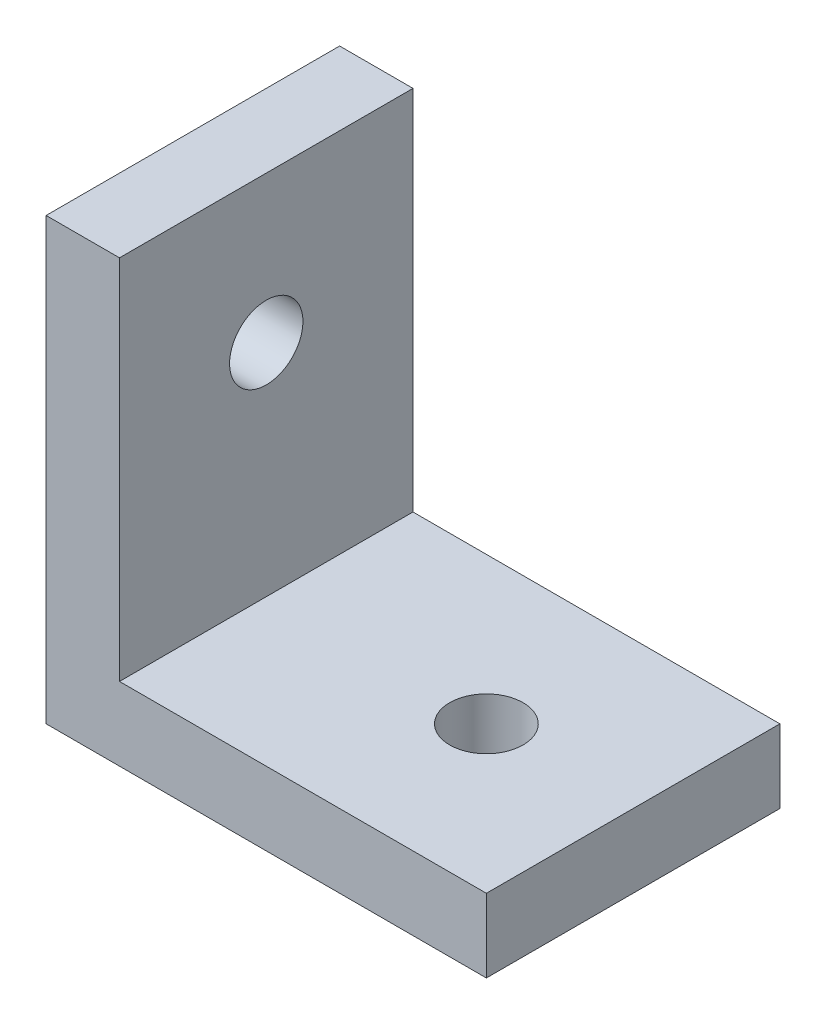
ISO-10303-21;
HEADER;
FILE_DESCRIPTION(('STEP AP214'),'2;1');
FILE_NAME('part.step','',(''),(''),'','','');
FILE_SCHEMA(('AUTOMOTIVE_DESIGN { 1 0 10303 214 1 1 1 1 }'));
ENDSEC;
DATA;
#1=APPLICATION_CONTEXT('core data for automotive mechanical design processes');
#2=APPLICATION_PROTOCOL_DEFINITION('international standard','automotive_design',2000,#1);
#3=PRODUCT_CONTEXT('',#1,'mechanical');
#4=PRODUCT('Part','Part','',(#3));
#5=PRODUCT_RELATED_PRODUCT_CATEGORY('part','',(#4));
#6=PRODUCT_DEFINITION_FORMATION('','',#4);
#7=PRODUCT_DEFINITION_CONTEXT('part definition',#1,'design');
#8=PRODUCT_DEFINITION('design','',#6,#7);
#9=PRODUCT_DEFINITION_SHAPE('','',#8);
#10=(LENGTH_UNIT() NAMED_UNIT(*) SI_UNIT(.MILLI.,.METRE.));
#11=(NAMED_UNIT(*) PLANE_ANGLE_UNIT() SI_UNIT($,.RADIAN.));
#12=(NAMED_UNIT(*) SI_UNIT($,.STERADIAN.) SOLID_ANGLE_UNIT());
#13=UNCERTAINTY_MEASURE_WITH_UNIT(LENGTH_MEASURE(1.E-05),#10,'distance_accuracy_value','');
#14=(GEOMETRIC_REPRESENTATION_CONTEXT(3) GLOBAL_UNCERTAINTY_ASSIGNED_CONTEXT((#13)) GLOBAL_UNIT_ASSIGNED_CONTEXT((#10,
#11,#12)) REPRESENTATION_CONTEXT('',''));
#15=CARTESIAN_POINT('',(0.,0.,0.));
#16=DIRECTION('',(0.,0.,1.));
#17=DIRECTION('',(1.,0.,0.));
#18=AXIS2_PLACEMENT_3D('',#15,#16,#17);
#19=CARTESIAN_POINT('',(-6.35,0.,25.4));
#20=DIRECTION('',(0.,-1.,0.));
#21=DIRECTION('',(0.,0.,-1.));
#22=AXIS2_PLACEMENT_3D('',#19,#20,#21);
#23=PLANE('',#22);
#24=DIRECTION('',(-1.,0.,0.));
#25=VECTOR('',#24,1.);
#26=CARTESIAN_POINT('',(-6.35,0.,0.));
#27=LINE('',#26,#25);
#28=CARTESIAN_POINT('',(0.,0.,0.));
#29=VERTEX_POINT('',#28);
#30=CARTESIAN_POINT('',(-6.35,0.,0.));
#31=VERTEX_POINT('',#30);
#32=EDGE_CURVE('E119',#29,#31,#27,.T.);
#33=ORIENTED_EDGE('',*,*,#32,.T.);
#34=DIRECTION('',(0.,0.,-1.));
#35=VECTOR('',#34,1.);
#36=CARTESIAN_POINT('',(-6.35,0.,25.4));
#37=LINE('',#36,#35);
#38=CARTESIAN_POINT('',(-6.35,0.,25.4));
#39=VERTEX_POINT('',#38);
#40=EDGE_CURVE('E11',#39,#31,#37,.T.);
#41=ORIENTED_EDGE('',*,*,#40,.F.);
#42=DIRECTION('',(-1.,0.,0.));
#43=VECTOR('',#42,1.);
#44=CARTESIAN_POINT('',(-6.35,0.,25.4));
#45=LINE('',#44,#43);
#46=CARTESIAN_POINT('',(0.,0.,25.4));
#47=VERTEX_POINT('',#46);
#48=EDGE_CURVE('E130',#47,#39,#45,.T.);
#49=ORIENTED_EDGE('',*,*,#48,.F.);
#50=DIRECTION('',(0.,0.,-1.));
#51=VECTOR('',#50,1.);
#52=CARTESIAN_POINT('',(0.,0.,25.4));
#53=LINE('',#52,#51);
#54=EDGE_CURVE('E115',#47,#29,#53,.T.);
#55=ORIENTED_EDGE('',*,*,#54,.T.);
#56=EDGE_LOOP('',(#33,#41,#49,#55));
#57=FACE_BOUND('',#56,.T.);
#58=ADVANCED_FACE('F35',(#57),#23,.F.);
#59=CARTESIAN_POINT('',(-6.35,0.,25.4));
#60=DIRECTION('',(1.,0.,0.));
#61=DIRECTION('',(0.,1.,0.));
#62=AXIS2_PLACEMENT_3D('',#59,#60,#61);
#63=PLANE('',#62);
#64=CARTESIAN_POINT('',(-6.35,-12.7,12.7));
#65=DIRECTION('',(1.,0.,0.));
#66=DIRECTION('',(0.,1.,0.));
#67=AXIS2_PLACEMENT_3D('',#64,#65,#66);
#68=CIRCLE('',#67,3.175);
#69=CARTESIAN_POINT('',(-6.35,-9.525,12.7));
#70=VERTEX_POINT('',#69);
#71=EDGE_CURVE('E123',#70,#70,#68,.F.);
#72=ORIENTED_EDGE('',*,*,#71,.F.);
#73=EDGE_LOOP('',(#72));
#74=FACE_BOUND('',#73,.T.);
#75=DIRECTION('',(0.,-1.,0.));
#76=VECTOR('',#75,1.);
#77=CARTESIAN_POINT('',(-6.35,0.,0.));
#78=LINE('',#77,#76);
#79=CARTESIAN_POINT('',(-6.35,-38.1,0.));
#80=VERTEX_POINT('',#79);
#81=EDGE_CURVE('E122',#31,#80,#78,.T.);
#82=ORIENTED_EDGE('',*,*,#81,.T.);
#83=DIRECTION('',(0.,0.,-1.));
#84=VECTOR('',#83,1.);
#85=CARTESIAN_POINT('',(-6.35,-38.1,25.4));
#86=LINE('',#85,#84);
#87=CARTESIAN_POINT('',(-6.35,-38.1,25.4));
#88=VERTEX_POINT('',#87);
#89=EDGE_CURVE('E43',#88,#80,#86,.T.);
#90=ORIENTED_EDGE('',*,*,#89,.F.);
#91=DIRECTION('',(0.,-1.,0.));
#92=VECTOR('',#91,1.);
#93=CARTESIAN_POINT('',(-6.35,0.,25.4));
#94=LINE('',#93,#92);
#95=EDGE_CURVE('E88',#39,#88,#94,.T.);
#96=ORIENTED_EDGE('',*,*,#95,.F.);
#97=ORIENTED_EDGE('',*,*,#40,.T.);
#98=EDGE_LOOP('',(#82,#90,#96,#97));
#99=FACE_BOUND('',#98,.T.);
#100=ADVANCED_FACE('F157',(#74,#99),#63,.F.);
#101=CARTESIAN_POINT('',(-6.35,-38.1,25.4));
#102=DIRECTION('',(0.,1.,0.));
#103=DIRECTION('',(0.,0.,1.));
#104=AXIS2_PLACEMENT_3D('',#101,#102,#103);
#105=PLANE('',#104);
#106=CARTESIAN_POINT('',(19.05,-38.1,12.7));
#107=DIRECTION('',(0.,1.,0.));
#108=DIRECTION('',(0.,0.,1.));
#109=AXIS2_PLACEMENT_3D('',#106,#107,#108);
#110=CIRCLE('',#109,3.175);
#111=CARTESIAN_POINT('',(19.05,-38.1,15.875));
#112=VERTEX_POINT('',#111);
#113=EDGE_CURVE('E238',#112,#112,#110,.F.);
#114=ORIENTED_EDGE('',*,*,#113,.F.);
#115=EDGE_LOOP('',(#114));
#116=FACE_BOUND('',#115,.T.);
#117=DIRECTION('',(1.,0.,0.));
#118=VECTOR('',#117,1.);
#119=CARTESIAN_POINT('',(-6.35,-38.1,0.));
#120=LINE('',#119,#118);
#121=CARTESIAN_POINT('',(31.75,-38.1,0.));
#122=VERTEX_POINT('',#121);
#123=EDGE_CURVE('E125',#80,#122,#120,.T.);
#124=ORIENTED_EDGE('',*,*,#123,.T.);
#125=DIRECTION('',(0.,0.,-1.));
#126=VECTOR('',#125,1.);
#127=CARTESIAN_POINT('',(31.75,-38.1,25.4));
#128=LINE('',#127,#126);
#129=CARTESIAN_POINT('',(31.75,-38.1,25.4));
#130=VERTEX_POINT('',#129);
#131=EDGE_CURVE('E110',#130,#122,#128,.T.);
#132=ORIENTED_EDGE('',*,*,#131,.F.);
#133=DIRECTION('',(1.,0.,0.));
#134=VECTOR('',#133,1.);
#135=CARTESIAN_POINT('',(-6.35,-38.1,25.4));
#136=LINE('',#135,#134);
#137=EDGE_CURVE('E101',#88,#130,#136,.T.);
#138=ORIENTED_EDGE('',*,*,#137,.F.);
#139=ORIENTED_EDGE('',*,*,#89,.T.);
#140=EDGE_LOOP('',(#124,#132,#138,#139));
#141=FACE_BOUND('',#140,.T.);
#142=ADVANCED_FACE('F136',(#116,#141),#105,.F.);
#143=CARTESIAN_POINT('',(31.75,-31.75,25.4));
#144=DIRECTION('',(-1.,0.,0.));
#145=DIRECTION('',(0.,0.,1.));
#146=AXIS2_PLACEMENT_3D('',#143,#144,#145);
#147=PLANE('',#146);
#148=DIRECTION('',(0.,1.,0.));
#149=VECTOR('',#148,1.);
#150=CARTESIAN_POINT('',(31.75,-31.75,0.));
#151=LINE('',#150,#149);
#152=CARTESIAN_POINT('',(31.75,-31.75,0.));
#153=VERTEX_POINT('',#152);
#154=EDGE_CURVE('E109',#122,#153,#151,.T.);
#155=ORIENTED_EDGE('',*,*,#154,.T.);
#156=DIRECTION('',(0.,0.,-1.));
#157=VECTOR('',#156,1.);
#158=CARTESIAN_POINT('',(31.75,-31.75,25.4));
#159=LINE('',#158,#157);
#160=CARTESIAN_POINT('',(31.75,-31.75,25.4));
#161=VERTEX_POINT('',#160);
#162=EDGE_CURVE('E106',#161,#153,#159,.T.);
#163=ORIENTED_EDGE('',*,*,#162,.F.);
#164=DIRECTION('',(0.,1.,0.));
#165=VECTOR('',#164,1.);
#166=CARTESIAN_POINT('',(31.75,-31.75,25.4));
#167=LINE('',#166,#165);
#168=EDGE_CURVE('E95',#130,#161,#167,.T.);
#169=ORIENTED_EDGE('',*,*,#168,.F.);
#170=ORIENTED_EDGE('',*,*,#131,.T.);
#171=EDGE_LOOP('',(#155,#163,#169,#170));
#172=FACE_BOUND('',#171,.T.);
#173=ADVANCED_FACE('F107',(#172),#147,.F.);
#174=CARTESIAN_POINT('',(0.,-31.75,25.4));
#175=DIRECTION('',(0.,-1.,0.));
#176=DIRECTION('',(0.,0.,-1.));
#177=AXIS2_PLACEMENT_3D('',#174,#175,#176);
#178=PLANE('',#177);
#179=CARTESIAN_POINT('',(19.05,-31.75,12.7));
#180=DIRECTION('',(0.,1.,0.));
#181=DIRECTION('',(0.,0.,1.));
#182=AXIS2_PLACEMENT_3D('',#179,#180,#181);
#183=CIRCLE('',#182,3.175);
#184=CARTESIAN_POINT('',(19.05,-31.75,15.875));
#185=VERTEX_POINT('',#184);
#186=EDGE_CURVE('E245',#185,#185,#183,.T.);
#187=ORIENTED_EDGE('',*,*,#186,.F.);
#188=EDGE_LOOP('',(#187));
#189=FACE_BOUND('',#188,.T.);
#190=DIRECTION('',(-1.,0.,0.));
#191=VECTOR('',#190,1.);
#192=CARTESIAN_POINT('',(0.,-31.75,0.));
#193=LINE('',#192,#191);
#194=CARTESIAN_POINT('',(0.,-31.75,0.));
#195=VERTEX_POINT('',#194);
#196=EDGE_CURVE('E74',#153,#195,#193,.T.);
#197=ORIENTED_EDGE('',*,*,#196,.T.);
#198=DIRECTION('',(0.,0.,-1.));
#199=VECTOR('',#198,1.);
#200=CARTESIAN_POINT('',(0.,-31.75,25.4));
#201=LINE('',#200,#199);
#202=CARTESIAN_POINT('',(0.,-31.75,25.4));
#203=VERTEX_POINT('',#202);
#204=EDGE_CURVE('E111',#203,#195,#201,.T.);
#205=ORIENTED_EDGE('',*,*,#204,.F.);
#206=DIRECTION('',(-1.,0.,0.));
#207=VECTOR('',#206,1.);
#208=CARTESIAN_POINT('',(0.,-31.75,25.4));
#209=LINE('',#208,#207);
#210=EDGE_CURVE('E99',#161,#203,#209,.T.);
#211=ORIENTED_EDGE('',*,*,#210,.F.);
#212=ORIENTED_EDGE('',*,*,#162,.T.);
#213=EDGE_LOOP('',(#197,#205,#211,#212));
#214=FACE_BOUND('',#213,.T.);
#215=ADVANCED_FACE('F113',(#189,#214),#178,.F.);
#216=CARTESIAN_POINT('',(0.,0.,25.4));
#217=DIRECTION('',(-1.,0.,0.));
#218=DIRECTION('',(0.,-1.,0.));
#219=AXIS2_PLACEMENT_3D('',#216,#217,#218);
#220=PLANE('',#219);
#221=CARTESIAN_POINT('',(0.,-12.7,12.7));
#222=DIRECTION('',(1.,0.,0.));
#223=DIRECTION('',(0.,1.,0.));
#224=AXIS2_PLACEMENT_3D('',#221,#222,#223);
#225=CIRCLE('',#224,3.175);
#226=CARTESIAN_POINT('',(0.,-9.525,12.7));
#227=VERTEX_POINT('',#226);
#228=EDGE_CURVE('E235',#227,#227,#225,.T.);
#229=ORIENTED_EDGE('',*,*,#228,.F.);
#230=EDGE_LOOP('',(#229));
#231=FACE_BOUND('',#230,.T.);
#232=DIRECTION('',(0.,1.,0.));
#233=VECTOR('',#232,1.);
#234=CARTESIAN_POINT('',(0.,0.,0.));
#235=LINE('',#234,#233);
#236=EDGE_CURVE('E80',#195,#29,#235,.T.);
#237=ORIENTED_EDGE('',*,*,#236,.T.);
#238=ORIENTED_EDGE('',*,*,#54,.F.);
#239=DIRECTION('',(0.,1.,0.));
#240=VECTOR('',#239,1.);
#241=CARTESIAN_POINT('',(0.,0.,25.4));
#242=LINE('',#241,#240);
#243=EDGE_CURVE('E51',#203,#47,#242,.T.);
#244=ORIENTED_EDGE('',*,*,#243,.F.);
#245=ORIENTED_EDGE('',*,*,#204,.T.);
#246=EDGE_LOOP('',(#237,#238,#244,#245));
#247=FACE_BOUND('',#246,.T.);
#248=ADVANCED_FACE('F143',(#231,#247),#220,.F.);
#249=CARTESIAN_POINT('',(0.,0.,25.4));
#250=DIRECTION('',(0.,0.,-1.));
#251=DIRECTION('',(-1.,0.,0.));
#252=AXIS2_PLACEMENT_3D('',#249,#250,#251);
#253=PLANE('',#252);
#254=ORIENTED_EDGE('',*,*,#48,.T.);
#255=ORIENTED_EDGE('',*,*,#95,.T.);
#256=ORIENTED_EDGE('',*,*,#137,.T.);
#257=ORIENTED_EDGE('',*,*,#168,.T.);
#258=ORIENTED_EDGE('',*,*,#210,.T.);
#259=ORIENTED_EDGE('',*,*,#243,.T.);
#260=EDGE_LOOP('',(#254,#255,#256,#257,#258,#259));
#261=FACE_BOUND('',#260,.T.);
#262=ADVANCED_FACE('F97',(#261),#253,.F.);
#263=CARTESIAN_POINT('',(0.,0.,0.));
#264=DIRECTION('',(0.,0.,-1.));
#265=DIRECTION('',(-1.,0.,0.));
#266=AXIS2_PLACEMENT_3D('',#263,#264,#265);
#267=PLANE('',#266);
#268=ORIENTED_EDGE('',*,*,#32,.F.);
#269=ORIENTED_EDGE('',*,*,#236,.F.);
#270=ORIENTED_EDGE('',*,*,#196,.F.);
#271=ORIENTED_EDGE('',*,*,#154,.F.);
#272=ORIENTED_EDGE('',*,*,#123,.F.);
#273=ORIENTED_EDGE('',*,*,#81,.F.);
#274=EDGE_LOOP('',(#268,#269,#270,#271,#272,#273));
#275=FACE_BOUND('',#274,.T.);
#276=ADVANCED_FACE('F139',(#275),#267,.T.);
#277=CARTESIAN_POINT('',(-6.351,-12.7,12.7));
#278=DIRECTION('',(1.,0.,0.));
#279=DIRECTION('',(0.,1.,0.));
#280=AXIS2_PLACEMENT_3D('',#277,#278,#279);
#281=CYLINDRICAL_SURFACE('',#280,3.175);
#282=ORIENTED_EDGE('',*,*,#228,.T.);
#283=EDGE_LOOP('',(#282));
#284=FACE_BOUND('',#283,.T.);
#285=ORIENTED_EDGE('',*,*,#71,.T.);
#286=EDGE_LOOP('',(#285));
#287=FACE_BOUND('',#286,.T.);
#288=ADVANCED_FACE('F192',(#284,#287),#281,.F.);
#289=CARTESIAN_POINT('',(19.05,-38.101,12.7));
#290=DIRECTION('',(0.,1.,0.));
#291=DIRECTION('',(0.,0.,1.));
#292=AXIS2_PLACEMENT_3D('',#289,#290,#291);
#293=CYLINDRICAL_SURFACE('',#292,3.175);
#294=CARTESIAN_POINT('',(19.05,-31.75,15.875));
#295=CARTESIAN_POINT('',(19.05,-31.8161458333333,15.875));
#296=CARTESIAN_POINT('',(19.05,-31.8822916666667,15.875));
#297=CARTESIAN_POINT('',(19.05,-32.0145833333333,15.875));
#298=CARTESIAN_POINT('',(19.05,-32.0807291666667,15.875));
#299=CARTESIAN_POINT('',(19.05,-32.2130208333333,15.875));
#300=CARTESIAN_POINT('',(19.05,-32.2791666666667,15.875));
#301=CARTESIAN_POINT('',(19.05,-32.4114583333333,15.875));
#302=CARTESIAN_POINT('',(19.05,-32.4776041666667,15.875));
#303=CARTESIAN_POINT('',(19.05,-32.6098958333333,15.875));
#304=CARTESIAN_POINT('',(19.05,-32.6760416666667,15.875));
#305=CARTESIAN_POINT('',(19.05,-32.8083333333333,15.875));
#306=CARTESIAN_POINT('',(19.05,-32.8744791666667,15.875));
#307=CARTESIAN_POINT('',(19.05,-33.0067708333333,15.875));
#308=CARTESIAN_POINT('',(19.05,-33.0729166666667,15.875));
#309=CARTESIAN_POINT('',(19.05,-33.2052083333333,15.875));
#310=CARTESIAN_POINT('',(19.05,-33.2713541666667,15.875));
#311=CARTESIAN_POINT('',(19.05,-33.4036458333333,15.875));
#312=CARTESIAN_POINT('',(19.05,-33.4697916666667,15.875));
#313=CARTESIAN_POINT('',(19.05,-33.6020833333333,15.875));
#314=CARTESIAN_POINT('',(19.05,-33.6682291666667,15.875));
#315=CARTESIAN_POINT('',(19.05,-33.8005208333333,15.875));
#316=CARTESIAN_POINT('',(19.05,-33.8666666666667,15.875));
#317=CARTESIAN_POINT('',(19.05,-33.9989583333333,15.875));
#318=CARTESIAN_POINT('',(19.05,-34.0651041666667,15.875));
#319=CARTESIAN_POINT('',(19.05,-34.1973958333333,15.875));
#320=CARTESIAN_POINT('',(19.05,-34.2635416666667,15.875));
#321=CARTESIAN_POINT('',(19.05,-34.3958333333333,15.875));
#322=CARTESIAN_POINT('',(19.05,-34.4619791666667,15.875));
#323=CARTESIAN_POINT('',(19.05,-34.5942708333333,15.875));
#324=CARTESIAN_POINT('',(19.05,-34.6604166666667,15.875));
#325=CARTESIAN_POINT('',(19.05,-34.7927083333333,15.875));
#326=CARTESIAN_POINT('',(19.05,-34.8588541666667,15.875));
#327=CARTESIAN_POINT('',(19.05,-34.9911458333333,15.875));
#328=CARTESIAN_POINT('',(19.05,-35.0572916666667,15.875));
#329=CARTESIAN_POINT('',(19.05,-35.1895833333333,15.875));
#330=CARTESIAN_POINT('',(19.05,-35.2557291666667,15.875));
#331=CARTESIAN_POINT('',(19.05,-35.3880208333333,15.875));
#332=CARTESIAN_POINT('',(19.05,-35.4541666666667,15.875));
#333=CARTESIAN_POINT('',(19.05,-35.5864583333333,15.875));
#334=CARTESIAN_POINT('',(19.05,-35.6526041666667,15.875));
#335=CARTESIAN_POINT('',(19.05,-35.7848958333333,15.875));
#336=CARTESIAN_POINT('',(19.05,-35.8510416666667,15.875));
#337=CARTESIAN_POINT('',(19.05,-35.9833333333333,15.875));
#338=CARTESIAN_POINT('',(19.05,-36.0494791666667,15.875));
#339=CARTESIAN_POINT('',(19.05,-36.1817708333333,15.875));
#340=CARTESIAN_POINT('',(19.05,-36.2479166666667,15.875));
#341=CARTESIAN_POINT('',(19.05,-36.3802083333333,15.875));
#342=CARTESIAN_POINT('',(19.05,-36.4463541666667,15.875));
#343=CARTESIAN_POINT('',(19.05,-36.5786458333333,15.875));
#344=CARTESIAN_POINT('',(19.05,-36.6447916666667,15.875));
#345=CARTESIAN_POINT('',(19.05,-36.7770833333333,15.875));
#346=CARTESIAN_POINT('',(19.05,-36.8432291666667,15.875));
#347=CARTESIAN_POINT('',(19.05,-36.9755208333333,15.875));
#348=CARTESIAN_POINT('',(19.05,-37.0416666666667,15.875));
#349=CARTESIAN_POINT('',(19.05,-37.1739583333333,15.875));
#350=CARTESIAN_POINT('',(19.05,-37.2401041666667,15.875));
#351=CARTESIAN_POINT('',(19.05,-37.3723958333333,15.875));
#352=CARTESIAN_POINT('',(19.05,-37.4385416666667,15.875));
#353=CARTESIAN_POINT('',(19.05,-37.5708333333333,15.875));
#354=CARTESIAN_POINT('',(19.05,-37.6369791666667,15.875));
#355=CARTESIAN_POINT('',(19.05,-37.7692708333333,15.875));
#356=CARTESIAN_POINT('',(19.05,-37.8354166666667,15.875));
#357=CARTESIAN_POINT('',(19.05,-37.9677083333333,15.875));
#358=CARTESIAN_POINT('',(19.05,-38.0338541666667,15.875));
#359=CARTESIAN_POINT('',(19.05,-38.1,15.875));
#360=B_SPLINE_CURVE_WITH_KNOTS('',3,(#294,#295,#296,#297,#298,#299,#300,#301,#302,#303,#304,
#305,#306,#307,#308,#309,#310,#311,#312,#313,#314,#315,#316,#317,#318,#319,#320,#321,#322,#323,
#324,#325,#326,#327,#328,#329,#330,#331,#332,#333,#334,#335,#336,#337,#338,#339,#340,#341,#342,
#343,#344,#345,#346,#347,#348,#349,#350,#351,#352,#353,#354,#355,#356,#357,#358,#359),
.UNSPECIFIED.,.F.,.F.,(4,2,2,2,2,2,2,2,2,2,2,2,2,2,2,2,2,2,2,2,2,2,2,2,2,2,2,2,2,2,2,2,4),(0.,
0.198437499999995,0.396874999999998,0.5953125,0.793749999999996,0.992187499999998,1.190625,
1.3890625,1.5875,1.78593749999999,1.984375,2.1828125,2.38124999999999,2.5796875,2.778125,
2.97656249999999,3.175,3.3734375,3.571875,3.7703125,3.96875,4.1671875,4.365625,4.5640625,4.7625,
4.9609375,5.159375,5.3578125,5.55625,5.7546875,5.953125,6.1515625,6.35),.UNSPECIFIED.);
#361=EDGE_CURVE('BSEAM188',#185,#112,#360,.T.);
#362=ORIENTED_EDGE('',*,*,#186,.T.);
#363=ORIENTED_EDGE('',*,*,#113,.T.);
#364=ORIENTED_EDGE('',*,*,#361,.T.);
#365=ORIENTED_EDGE('',*,*,#361,.F.);
#366=EDGE_LOOP('',(#362,#364,#363,#365));
#367=FACE_BOUND('',#366,.T.);
#368=ADVANCED_FACE('F188',(#367),#293,.F.);
#369=CLOSED_SHELL('',(#58,#100,#142,#173,#215,#248,#262,#276,#288,#368));
#370=MANIFOLD_SOLID_BREP('B2',#369);
#371=ADVANCED_BREP_SHAPE_REPRESENTATION('',(#18,#370),#14);
#372=SHAPE_DEFINITION_REPRESENTATION(#9,#371);
ENDSEC;
END-ISO-10303-21;
